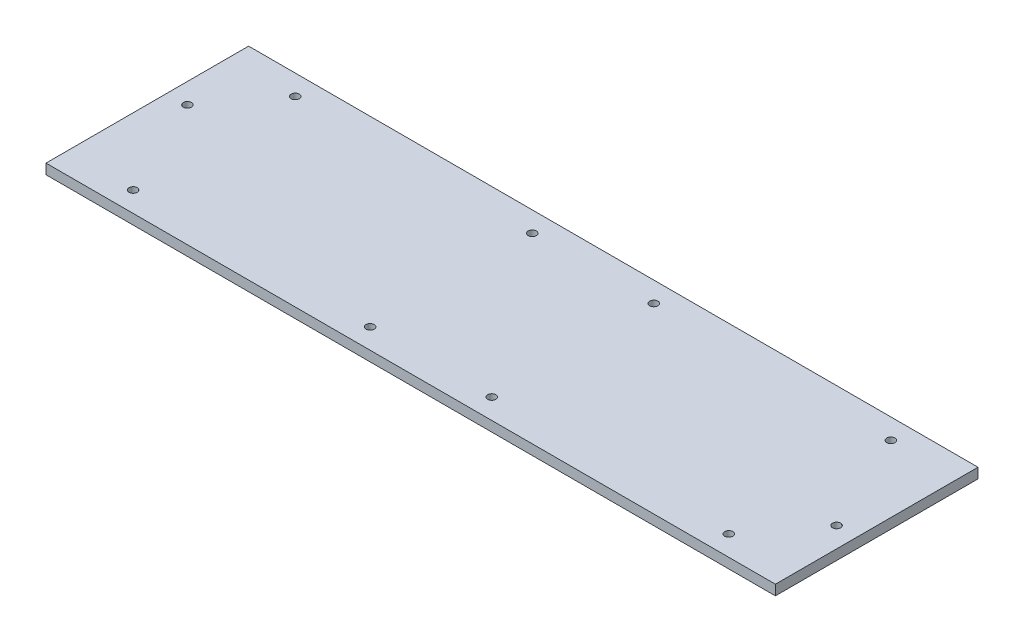
ISO-10303-21;
HEADER;
FILE_DESCRIPTION(('STEP AP214'),'2;1');
FILE_NAME('part.step','',(''),(''),'','','');
FILE_SCHEMA(('AUTOMOTIVE_DESIGN { 1 0 10303 214 1 1 1 1 }'));
ENDSEC;
DATA;
#1=APPLICATION_CONTEXT('core data for automotive mechanical design processes');
#2=APPLICATION_PROTOCOL_DEFINITION('international standard','automotive_design',2000,#1);
#3=PRODUCT_CONTEXT('',#1,'mechanical');
#4=PRODUCT('Part','Part','',(#3));
#5=PRODUCT_RELATED_PRODUCT_CATEGORY('part','',(#4));
#6=PRODUCT_DEFINITION_FORMATION('','',#4);
#7=PRODUCT_DEFINITION_CONTEXT('part definition',#1,'design');
#8=PRODUCT_DEFINITION('design','',#6,#7);
#9=PRODUCT_DEFINITION_SHAPE('','',#8);
#10=(LENGTH_UNIT() NAMED_UNIT(*) SI_UNIT(.MILLI.,.METRE.));
#11=(NAMED_UNIT(*) PLANE_ANGLE_UNIT() SI_UNIT($,.RADIAN.));
#12=(NAMED_UNIT(*) SI_UNIT($,.STERADIAN.) SOLID_ANGLE_UNIT());
#13=UNCERTAINTY_MEASURE_WITH_UNIT(LENGTH_MEASURE(1.E-05),#10,'distance_accuracy_value','');
#14=(GEOMETRIC_REPRESENTATION_CONTEXT(3) GLOBAL_UNCERTAINTY_ASSIGNED_CONTEXT((#13)) GLOBAL_UNIT_ASSIGNED_CONTEXT((#10,
#11,#12)) REPRESENTATION_CONTEXT('',''));
#15=CARTESIAN_POINT('',(0.,0.,0.));
#16=DIRECTION('',(0.,0.,1.));
#17=DIRECTION('',(1.,0.,0.));
#18=AXIS2_PLACEMENT_3D('',#15,#16,#17);
#19=CARTESIAN_POINT('',(0.,6.35,0.));
#20=DIRECTION('',(0.,-1.,0.));
#21=DIRECTION('',(0.,0.,-1.));
#22=AXIS2_PLACEMENT_3D('',#19,#20,#21);
#23=PLANE('',#22);
#24=DIRECTION('',(0.,0.,1.));
#25=VECTOR('',#24,1.);
#26=CARTESIAN_POINT('',(0.,6.35,0.));
#27=LINE('',#26,#25);
#28=CARTESIAN_POINT('',(0.,6.35,-127.));
#29=VERTEX_POINT('',#28);
#30=CARTESIAN_POINT('',(0.,6.35,0.));
#31=VERTEX_POINT('',#30);
#32=EDGE_CURVE('E87',#29,#31,#27,.T.);
#33=ORIENTED_EDGE('',*,*,#32,.T.);
#34=DIRECTION('',(1.,0.,0.));
#35=VECTOR('',#34,1.);
#36=CARTESIAN_POINT('',(0.,6.35,0.));
#37=LINE('',#36,#35);
#38=CARTESIAN_POINT('',(457.2,6.35,0.));
#39=VERTEX_POINT('',#38);
#40=EDGE_CURVE('E82',#31,#39,#37,.T.);
#41=ORIENTED_EDGE('',*,*,#40,.T.);
#42=DIRECTION('',(0.,0.,-1.));
#43=VECTOR('',#42,1.);
#44=CARTESIAN_POINT('',(457.2,6.35,0.));
#45=LINE('',#44,#43);
#46=CARTESIAN_POINT('',(457.2,6.35,-127.));
#47=VERTEX_POINT('',#46);
#48=EDGE_CURVE('E85',#39,#47,#45,.T.);
#49=ORIENTED_EDGE('',*,*,#48,.T.);
#50=DIRECTION('',(-1.,0.,0.));
#51=VECTOR('',#50,1.);
#52=CARTESIAN_POINT('',(0.,6.35,-127.));
#53=LINE('',#52,#51);
#54=EDGE_CURVE('E52',#47,#29,#53,.T.);
#55=ORIENTED_EDGE('',*,*,#54,.T.);
#56=EDGE_LOOP('',(#33,#41,#49,#55));
#57=FACE_BOUND('',#56,.T.);
#58=CARTESIAN_POINT('',(41.91,6.35,-114.3));
#59=DIRECTION('',(0.,1.,0.));
#60=DIRECTION('',(0.,0.,1.));
#61=AXIS2_PLACEMENT_3D('',#58,#59,#60);
#62=CIRCLE('',#61,2.55269999999998);
#63=CARTESIAN_POINT('',(41.91,6.35,-111.7473));
#64=VERTEX_POINT('',#63);
#65=EDGE_CURVE('E102',#64,#64,#62,.T.);
#66=ORIENTED_EDGE('',*,*,#65,.F.);
#67=EDGE_LOOP('',(#66));
#68=FACE_BOUND('',#67,.T.);
#69=CARTESIAN_POINT('',(415.29,6.35,-114.3));
#70=DIRECTION('',(0.,1.,0.));
#71=DIRECTION('',(0.,0.,1.));
#72=AXIS2_PLACEMENT_3D('',#69,#70,#71);
#73=CIRCLE('',#72,2.55270000000004);
#74=CARTESIAN_POINT('',(415.29,6.35,-111.7473));
#75=VERTEX_POINT('',#74);
#76=EDGE_CURVE('E117',#75,#75,#73,.T.);
#77=ORIENTED_EDGE('',*,*,#76,.F.);
#78=EDGE_LOOP('',(#77));
#79=FACE_BOUND('',#78,.T.);
#80=CARTESIAN_POINT('',(190.5,6.35,-114.3));
#81=DIRECTION('',(0.,1.,0.));
#82=DIRECTION('',(0.,0.,1.));
#83=AXIS2_PLACEMENT_3D('',#80,#81,#82);
#84=CIRCLE('',#83,2.55269999999998);
#85=CARTESIAN_POINT('',(190.5,6.35,-111.7473));
#86=VERTEX_POINT('',#85);
#87=EDGE_CURVE('E123',#86,#86,#84,.T.);
#88=ORIENTED_EDGE('',*,*,#87,.F.);
#89=EDGE_LOOP('',(#88));
#90=FACE_BOUND('',#89,.T.);
#91=CARTESIAN_POINT('',(266.7,6.35,-114.3));
#92=DIRECTION('',(0.,1.,0.));
#93=DIRECTION('',(0.,0.,1.));
#94=AXIS2_PLACEMENT_3D('',#91,#92,#93);
#95=CIRCLE('',#94,2.55270000000004);
#96=CARTESIAN_POINT('',(266.7,6.35,-111.7473));
#97=VERTEX_POINT('',#96);
#98=EDGE_CURVE('E129',#97,#97,#95,.T.);
#99=ORIENTED_EDGE('',*,*,#98,.F.);
#100=EDGE_LOOP('',(#99));
#101=FACE_BOUND('',#100,.T.);
#102=CARTESIAN_POINT('',(190.5,6.35,-12.7));
#103=DIRECTION('',(0.,1.,0.));
#104=DIRECTION('',(0.,0.,1.));
#105=AXIS2_PLACEMENT_3D('',#102,#103,#104);
#106=CIRCLE('',#105,2.55269999999998);
#107=CARTESIAN_POINT('',(190.5,6.35,-10.1473));
#108=VERTEX_POINT('',#107);
#109=EDGE_CURVE('E135',#108,#108,#106,.T.);
#110=ORIENTED_EDGE('',*,*,#109,.F.);
#111=EDGE_LOOP('',(#110));
#112=FACE_BOUND('',#111,.T.);
#113=CARTESIAN_POINT('',(415.29,6.35,-12.7));
#114=DIRECTION('',(0.,1.,0.));
#115=DIRECTION('',(0.,0.,1.));
#116=AXIS2_PLACEMENT_3D('',#113,#114,#115);
#117=CIRCLE('',#116,2.55270000000004);
#118=CARTESIAN_POINT('',(415.29,6.35,-10.1472999999999));
#119=VERTEX_POINT('',#118);
#120=EDGE_CURVE('E141',#119,#119,#117,.T.);
#121=ORIENTED_EDGE('',*,*,#120,.F.);
#122=EDGE_LOOP('',(#121));
#123=FACE_BOUND('',#122,.T.);
#124=CARTESIAN_POINT('',(41.91,6.35,-12.7));
#125=DIRECTION('',(0.,1.,0.));
#126=DIRECTION('',(0.,0.,1.));
#127=AXIS2_PLACEMENT_3D('',#124,#125,#126);
#128=CIRCLE('',#127,2.5527);
#129=CARTESIAN_POINT('',(41.91,6.35,-10.1473));
#130=VERTEX_POINT('',#129);
#131=EDGE_CURVE('E147',#130,#130,#128,.T.);
#132=ORIENTED_EDGE('',*,*,#131,.F.);
#133=EDGE_LOOP('',(#132));
#134=FACE_BOUND('',#133,.T.);
#135=CARTESIAN_POINT('',(266.7,6.35,-12.7));
#136=DIRECTION('',(0.,1.,0.));
#137=DIRECTION('',(0.,0.,1.));
#138=AXIS2_PLACEMENT_3D('',#135,#136,#137);
#139=CIRCLE('',#138,2.55270000000004);
#140=CARTESIAN_POINT('',(266.7,6.35,-10.1472999999999));
#141=VERTEX_POINT('',#140);
#142=EDGE_CURVE('E153',#141,#141,#139,.T.);
#143=ORIENTED_EDGE('',*,*,#142,.F.);
#144=EDGE_LOOP('',(#143));
#145=FACE_BOUND('',#144,.T.);
#146=CARTESIAN_POINT('',(444.5,6.35,-51.054));
#147=DIRECTION('',(0.,1.,0.));
#148=DIRECTION('',(0.,0.,1.));
#149=AXIS2_PLACEMENT_3D('',#146,#147,#148);
#150=CIRCLE('',#149,2.55270000000004);
#151=CARTESIAN_POINT('',(444.5,6.35,-48.5013));
#152=VERTEX_POINT('',#151);
#153=EDGE_CURVE('E159',#152,#152,#150,.T.);
#154=ORIENTED_EDGE('',*,*,#153,.F.);
#155=EDGE_LOOP('',(#154));
#156=FACE_BOUND('',#155,.T.);
#157=CARTESIAN_POINT('',(12.7,6.35,-75.946));
#158=DIRECTION('',(0.,1.,0.));
#159=DIRECTION('',(0.,0.,1.));
#160=AXIS2_PLACEMENT_3D('',#157,#158,#159);
#161=CIRCLE('',#160,2.55269999999999);
#162=CARTESIAN_POINT('',(12.7,6.35,-73.3933));
#163=VERTEX_POINT('',#162);
#164=EDGE_CURVE('E165',#163,#163,#161,.T.);
#165=ORIENTED_EDGE('',*,*,#164,.F.);
#166=EDGE_LOOP('',(#165));
#167=FACE_BOUND('',#166,.T.);
#168=ADVANCED_FACE('F35',(#57,#68,#79,#90,#101,#112,#123,#134,#145,#156,#167),#23,.F.);
#169=CARTESIAN_POINT('',(0.,0.,0.));
#170=DIRECTION('',(0.,-1.,0.));
#171=DIRECTION('',(0.,0.,-1.));
#172=AXIS2_PLACEMENT_3D('',#169,#170,#171);
#173=PLANE('',#172);
#174=CARTESIAN_POINT('',(444.5,0.,-51.054));
#175=DIRECTION('',(0.,1.,0.));
#176=DIRECTION('',(0.,0.,1.));
#177=AXIS2_PLACEMENT_3D('',#174,#175,#176);
#178=CIRCLE('',#177,2.55270000000004);
#179=CARTESIAN_POINT('',(444.5,0.,-48.5013));
#180=VERTEX_POINT('',#179);
#181=EDGE_CURVE('E162',#180,#180,#178,.T.);
#182=ORIENTED_EDGE('',*,*,#181,.T.);
#183=EDGE_LOOP('',(#182));
#184=FACE_BOUND('',#183,.T.);
#185=CARTESIAN_POINT('',(41.91,0.,-12.7));
#186=DIRECTION('',(0.,1.,0.));
#187=DIRECTION('',(0.,0.,1.));
#188=AXIS2_PLACEMENT_3D('',#185,#186,#187);
#189=CIRCLE('',#188,2.5527);
#190=CARTESIAN_POINT('',(41.91,0.,-10.1473));
#191=VERTEX_POINT('',#190);
#192=EDGE_CURVE('E150',#191,#191,#189,.T.);
#193=ORIENTED_EDGE('',*,*,#192,.T.);
#194=EDGE_LOOP('',(#193));
#195=FACE_BOUND('',#194,.T.);
#196=CARTESIAN_POINT('',(190.5,0.,-12.7));
#197=DIRECTION('',(0.,1.,0.));
#198=DIRECTION('',(0.,0.,1.));
#199=AXIS2_PLACEMENT_3D('',#196,#197,#198);
#200=CIRCLE('',#199,2.55269999999998);
#201=CARTESIAN_POINT('',(190.5,0.,-10.1473));
#202=VERTEX_POINT('',#201);
#203=EDGE_CURVE('E138',#202,#202,#200,.T.);
#204=ORIENTED_EDGE('',*,*,#203,.T.);
#205=EDGE_LOOP('',(#204));
#206=FACE_BOUND('',#205,.T.);
#207=CARTESIAN_POINT('',(190.5,0.,-114.3));
#208=DIRECTION('',(0.,1.,0.));
#209=DIRECTION('',(0.,0.,1.));
#210=AXIS2_PLACEMENT_3D('',#207,#208,#209);
#211=CIRCLE('',#210,2.55269999999998);
#212=CARTESIAN_POINT('',(190.5,0.,-111.7473));
#213=VERTEX_POINT('',#212);
#214=EDGE_CURVE('E126',#213,#213,#211,.T.);
#215=ORIENTED_EDGE('',*,*,#214,.T.);
#216=EDGE_LOOP('',(#215));
#217=FACE_BOUND('',#216,.T.);
#218=CARTESIAN_POINT('',(41.91,0.,-114.3));
#219=DIRECTION('',(0.,1.,0.));
#220=DIRECTION('',(0.,0.,1.));
#221=AXIS2_PLACEMENT_3D('',#218,#219,#220);
#222=CIRCLE('',#221,2.55269999999998);
#223=CARTESIAN_POINT('',(41.91,0.,-111.7473));
#224=VERTEX_POINT('',#223);
#225=EDGE_CURVE('E114',#224,#224,#222,.T.);
#226=ORIENTED_EDGE('',*,*,#225,.T.);
#227=EDGE_LOOP('',(#226));
#228=FACE_BOUND('',#227,.T.);
#229=DIRECTION('',(0.,0.,1.));
#230=VECTOR('',#229,1.);
#231=CARTESIAN_POINT('',(0.,0.,0.));
#232=LINE('',#231,#230);
#233=CARTESIAN_POINT('',(0.,0.,-127.));
#234=VERTEX_POINT('',#233);
#235=CARTESIAN_POINT('',(0.,0.,0.));
#236=VERTEX_POINT('',#235);
#237=EDGE_CURVE('E99',#234,#236,#232,.T.);
#238=ORIENTED_EDGE('',*,*,#237,.F.);
#239=DIRECTION('',(-1.,0.,0.));
#240=VECTOR('',#239,1.);
#241=CARTESIAN_POINT('',(0.,0.,-127.));
#242=LINE('',#241,#240);
#243=CARTESIAN_POINT('',(457.2,0.,-127.));
#244=VERTEX_POINT('',#243);
#245=EDGE_CURVE('E75',#244,#234,#242,.T.);
#246=ORIENTED_EDGE('',*,*,#245,.F.);
#247=DIRECTION('',(0.,0.,-1.));
#248=VECTOR('',#247,1.);
#249=CARTESIAN_POINT('',(457.2,0.,0.));
#250=LINE('',#249,#248);
#251=CARTESIAN_POINT('',(457.2,0.,0.));
#252=VERTEX_POINT('',#251);
#253=EDGE_CURVE('E69',#252,#244,#250,.T.);
#254=ORIENTED_EDGE('',*,*,#253,.F.);
#255=DIRECTION('',(1.,0.,0.));
#256=VECTOR('',#255,1.);
#257=CARTESIAN_POINT('',(0.,0.,0.));
#258=LINE('',#257,#256);
#259=EDGE_CURVE('E91',#236,#252,#258,.T.);
#260=ORIENTED_EDGE('',*,*,#259,.F.);
#261=EDGE_LOOP('',(#238,#246,#254,#260));
#262=FACE_BOUND('',#261,.T.);
#263=CARTESIAN_POINT('',(415.29,0.,-114.3));
#264=DIRECTION('',(0.,1.,0.));
#265=DIRECTION('',(0.,0.,1.));
#266=AXIS2_PLACEMENT_3D('',#263,#264,#265);
#267=CIRCLE('',#266,2.55270000000004);
#268=CARTESIAN_POINT('',(415.29,0.,-111.7473));
#269=VERTEX_POINT('',#268);
#270=EDGE_CURVE('E120',#269,#269,#267,.T.);
#271=ORIENTED_EDGE('',*,*,#270,.T.);
#272=EDGE_LOOP('',(#271));
#273=FACE_BOUND('',#272,.T.);
#274=CARTESIAN_POINT('',(266.7,0.,-114.3));
#275=DIRECTION('',(0.,1.,0.));
#276=DIRECTION('',(0.,0.,1.));
#277=AXIS2_PLACEMENT_3D('',#274,#275,#276);
#278=CIRCLE('',#277,2.55270000000004);
#279=CARTESIAN_POINT('',(266.7,0.,-111.7473));
#280=VERTEX_POINT('',#279);
#281=EDGE_CURVE('E132',#280,#280,#278,.T.);
#282=ORIENTED_EDGE('',*,*,#281,.T.);
#283=EDGE_LOOP('',(#282));
#284=FACE_BOUND('',#283,.T.);
#285=CARTESIAN_POINT('',(415.29,0.,-12.7));
#286=DIRECTION('',(0.,1.,0.));
#287=DIRECTION('',(0.,0.,1.));
#288=AXIS2_PLACEMENT_3D('',#285,#286,#287);
#289=CIRCLE('',#288,2.55270000000004);
#290=CARTESIAN_POINT('',(415.29,0.,-10.1472999999999));
#291=VERTEX_POINT('',#290);
#292=EDGE_CURVE('E144',#291,#291,#289,.T.);
#293=ORIENTED_EDGE('',*,*,#292,.T.);
#294=EDGE_LOOP('',(#293));
#295=FACE_BOUND('',#294,.T.);
#296=CARTESIAN_POINT('',(266.7,0.,-12.7));
#297=DIRECTION('',(0.,1.,0.));
#298=DIRECTION('',(0.,0.,1.));
#299=AXIS2_PLACEMENT_3D('',#296,#297,#298);
#300=CIRCLE('',#299,2.55270000000004);
#301=CARTESIAN_POINT('',(266.7,0.,-10.1472999999999));
#302=VERTEX_POINT('',#301);
#303=EDGE_CURVE('E156',#302,#302,#300,.T.);
#304=ORIENTED_EDGE('',*,*,#303,.T.);
#305=EDGE_LOOP('',(#304));
#306=FACE_BOUND('',#305,.T.);
#307=CARTESIAN_POINT('',(12.7,0.,-75.946));
#308=DIRECTION('',(0.,1.,0.));
#309=DIRECTION('',(0.,0.,1.));
#310=AXIS2_PLACEMENT_3D('',#307,#308,#309);
#311=CIRCLE('',#310,2.55269999999999);
#312=CARTESIAN_POINT('',(12.7,0.,-73.3933));
#313=VERTEX_POINT('',#312);
#314=EDGE_CURVE('E168',#313,#313,#311,.T.);
#315=ORIENTED_EDGE('',*,*,#314,.T.);
#316=EDGE_LOOP('',(#315));
#317=FACE_BOUND('',#316,.T.);
#318=ADVANCED_FACE('F110',(#184,#195,#206,#217,#228,#262,#273,#284,#295,#306,#317),#173,.T.);
#319=CARTESIAN_POINT('',(0.,6.35,0.));
#320=DIRECTION('',(1.,0.,0.));
#321=DIRECTION('',(0.,0.,-1.));
#322=AXIS2_PLACEMENT_3D('',#319,#320,#321);
#323=PLANE('',#322);
#324=ORIENTED_EDGE('',*,*,#237,.T.);
#325=DIRECTION('',(0.,-1.,0.));
#326=VECTOR('',#325,1.);
#327=CARTESIAN_POINT('',(0.,6.35,0.));
#328=LINE('',#327,#326);
#329=EDGE_CURVE('E11',#31,#236,#328,.T.);
#330=ORIENTED_EDGE('',*,*,#329,.F.);
#331=ORIENTED_EDGE('',*,*,#32,.F.);
#332=DIRECTION('',(0.,-1.,0.));
#333=VECTOR('',#332,1.);
#334=CARTESIAN_POINT('',(0.,6.35,-127.));
#335=LINE('',#334,#333);
#336=EDGE_CURVE('E95',#29,#234,#335,.T.);
#337=ORIENTED_EDGE('',*,*,#336,.T.);
#338=EDGE_LOOP('',(#324,#330,#331,#337));
#339=FACE_BOUND('',#338,.T.);
#340=ADVANCED_FACE('F37',(#339),#323,.F.);
#341=CARTESIAN_POINT('',(0.,6.35,0.));
#342=DIRECTION('',(0.,0.,-1.));
#343=DIRECTION('',(-1.,0.,0.));
#344=AXIS2_PLACEMENT_3D('',#341,#342,#343);
#345=PLANE('',#344);
#346=ORIENTED_EDGE('',*,*,#259,.T.);
#347=DIRECTION('',(0.,-1.,0.));
#348=VECTOR('',#347,1.);
#349=CARTESIAN_POINT('',(457.2,6.35,0.));
#350=LINE('',#349,#348);
#351=EDGE_CURVE('E44',#39,#252,#350,.T.);
#352=ORIENTED_EDGE('',*,*,#351,.F.);
#353=ORIENTED_EDGE('',*,*,#40,.F.);
#354=ORIENTED_EDGE('',*,*,#329,.T.);
#355=EDGE_LOOP('',(#346,#352,#353,#354));
#356=FACE_BOUND('',#355,.T.);
#357=ADVANCED_FACE('F90',(#356),#345,.F.);
#358=CARTESIAN_POINT('',(457.2,6.35,0.));
#359=DIRECTION('',(-1.,0.,0.));
#360=DIRECTION('',(0.,0.,1.));
#361=AXIS2_PLACEMENT_3D('',#358,#359,#360);
#362=PLANE('',#361);
#363=ORIENTED_EDGE('',*,*,#253,.T.);
#364=DIRECTION('',(0.,-1.,0.));
#365=VECTOR('',#364,1.);
#366=CARTESIAN_POINT('',(457.2,6.35,-127.));
#367=LINE('',#366,#365);
#368=EDGE_CURVE('E92',#47,#244,#367,.T.);
#369=ORIENTED_EDGE('',*,*,#368,.F.);
#370=ORIENTED_EDGE('',*,*,#48,.F.);
#371=ORIENTED_EDGE('',*,*,#351,.T.);
#372=EDGE_LOOP('',(#363,#369,#370,#371));
#373=FACE_BOUND('',#372,.T.);
#374=ADVANCED_FACE('F93',(#373),#362,.F.);
#375=CARTESIAN_POINT('',(0.,6.35,-127.));
#376=DIRECTION('',(0.,0.,1.));
#377=DIRECTION('',(1.,0.,0.));
#378=AXIS2_PLACEMENT_3D('',#375,#376,#377);
#379=PLANE('',#378);
#380=ORIENTED_EDGE('',*,*,#245,.T.);
#381=ORIENTED_EDGE('',*,*,#336,.F.);
#382=ORIENTED_EDGE('',*,*,#54,.F.);
#383=ORIENTED_EDGE('',*,*,#368,.T.);
#384=EDGE_LOOP('',(#380,#381,#382,#383));
#385=FACE_BOUND('',#384,.T.);
#386=ADVANCED_FACE('F107',(#385),#379,.F.);
#387=CARTESIAN_POINT('',(41.91,6.35,-114.3));
#388=DIRECTION('',(0.,-1.,0.));
#389=DIRECTION('',(0.,0.,-1.));
#390=AXIS2_PLACEMENT_3D('',#387,#388,#389);
#391=CYLINDRICAL_SURFACE('',#390,2.55269999999998);
#392=ORIENTED_EDGE('',*,*,#65,.T.);
#393=EDGE_LOOP('',(#392));
#394=FACE_BOUND('',#393,.T.);
#395=ORIENTED_EDGE('',*,*,#225,.F.);
#396=EDGE_LOOP('',(#395));
#397=FACE_BOUND('',#396,.T.);
#398=ADVANCED_FACE('F185',(#394,#397),#391,.F.);
#399=CARTESIAN_POINT('',(415.29,6.35,-114.3));
#400=DIRECTION('',(0.,-1.,0.));
#401=DIRECTION('',(0.,0.,-1.));
#402=AXIS2_PLACEMENT_3D('',#399,#400,#401);
#403=CYLINDRICAL_SURFACE('',#402,2.55270000000004);
#404=ORIENTED_EDGE('',*,*,#76,.T.);
#405=EDGE_LOOP('',(#404));
#406=FACE_BOUND('',#405,.T.);
#407=ORIENTED_EDGE('',*,*,#270,.F.);
#408=EDGE_LOOP('',(#407));
#409=FACE_BOUND('',#408,.T.);
#410=ADVANCED_FACE('F231',(#406,#409),#403,.F.);
#411=CARTESIAN_POINT('',(190.5,6.35,-114.3));
#412=DIRECTION('',(0.,-1.,0.));
#413=DIRECTION('',(0.,0.,-1.));
#414=AXIS2_PLACEMENT_3D('',#411,#412,#413);
#415=CYLINDRICAL_SURFACE('',#414,2.55269999999998);
#416=ORIENTED_EDGE('',*,*,#87,.T.);
#417=EDGE_LOOP('',(#416));
#418=FACE_BOUND('',#417,.T.);
#419=ORIENTED_EDGE('',*,*,#214,.F.);
#420=EDGE_LOOP('',(#419));
#421=FACE_BOUND('',#420,.T.);
#422=ADVANCED_FACE('F239',(#418,#421),#415,.F.);
#423=CARTESIAN_POINT('',(266.7,6.35,-114.3));
#424=DIRECTION('',(0.,-1.,0.));
#425=DIRECTION('',(0.,0.,-1.));
#426=AXIS2_PLACEMENT_3D('',#423,#424,#425);
#427=CYLINDRICAL_SURFACE('',#426,2.55270000000004);
#428=ORIENTED_EDGE('',*,*,#98,.T.);
#429=EDGE_LOOP('',(#428));
#430=FACE_BOUND('',#429,.T.);
#431=ORIENTED_EDGE('',*,*,#281,.F.);
#432=EDGE_LOOP('',(#431));
#433=FACE_BOUND('',#432,.T.);
#434=ADVANCED_FACE('F247',(#430,#433),#427,.F.);
#435=CARTESIAN_POINT('',(190.5,6.35,-12.7));
#436=DIRECTION('',(0.,-1.,0.));
#437=DIRECTION('',(0.,0.,-1.));
#438=AXIS2_PLACEMENT_3D('',#435,#436,#437);
#439=CYLINDRICAL_SURFACE('',#438,2.55269999999998);
#440=ORIENTED_EDGE('',*,*,#109,.T.);
#441=EDGE_LOOP('',(#440));
#442=FACE_BOUND('',#441,.T.);
#443=ORIENTED_EDGE('',*,*,#203,.F.);
#444=EDGE_LOOP('',(#443));
#445=FACE_BOUND('',#444,.T.);
#446=ADVANCED_FACE('F256',(#442,#445),#439,.F.);
#447=CARTESIAN_POINT('',(415.29,6.35,-12.7));
#448=DIRECTION('',(0.,-1.,0.));
#449=DIRECTION('',(0.,0.,-1.));
#450=AXIS2_PLACEMENT_3D('',#447,#448,#449);
#451=CYLINDRICAL_SURFACE('',#450,2.55270000000004);
#452=ORIENTED_EDGE('',*,*,#120,.T.);
#453=EDGE_LOOP('',(#452));
#454=FACE_BOUND('',#453,.T.);
#455=ORIENTED_EDGE('',*,*,#292,.F.);
#456=EDGE_LOOP('',(#455));
#457=FACE_BOUND('',#456,.T.);
#458=ADVANCED_FACE('F265',(#454,#457),#451,.F.);
#459=CARTESIAN_POINT('',(41.91,6.35,-12.7));
#460=DIRECTION('',(0.,-1.,0.));
#461=DIRECTION('',(0.,0.,-1.));
#462=AXIS2_PLACEMENT_3D('',#459,#460,#461);
#463=CYLINDRICAL_SURFACE('',#462,2.5527);
#464=ORIENTED_EDGE('',*,*,#131,.T.);
#465=EDGE_LOOP('',(#464));
#466=FACE_BOUND('',#465,.T.);
#467=ORIENTED_EDGE('',*,*,#192,.F.);
#468=EDGE_LOOP('',(#467));
#469=FACE_BOUND('',#468,.T.);
#470=ADVANCED_FACE('F274',(#466,#469),#463,.F.);
#471=CARTESIAN_POINT('',(266.7,6.35,-12.7));
#472=DIRECTION('',(0.,-1.,0.));
#473=DIRECTION('',(0.,0.,-1.));
#474=AXIS2_PLACEMENT_3D('',#471,#472,#473);
#475=CYLINDRICAL_SURFACE('',#474,2.55270000000004);
#476=ORIENTED_EDGE('',*,*,#142,.T.);
#477=EDGE_LOOP('',(#476));
#478=FACE_BOUND('',#477,.T.);
#479=ORIENTED_EDGE('',*,*,#303,.F.);
#480=EDGE_LOOP('',(#479));
#481=FACE_BOUND('',#480,.T.);
#482=ADVANCED_FACE('F283',(#478,#481),#475,.F.);
#483=CARTESIAN_POINT('',(444.5,6.35,-51.054));
#484=DIRECTION('',(0.,-1.,0.));
#485=DIRECTION('',(0.,0.,-1.));
#486=AXIS2_PLACEMENT_3D('',#483,#484,#485);
#487=CYLINDRICAL_SURFACE('',#486,2.55270000000004);
#488=ORIENTED_EDGE('',*,*,#153,.T.);
#489=EDGE_LOOP('',(#488));
#490=FACE_BOUND('',#489,.T.);
#491=ORIENTED_EDGE('',*,*,#181,.F.);
#492=EDGE_LOOP('',(#491));
#493=FACE_BOUND('',#492,.T.);
#494=ADVANCED_FACE('F292',(#490,#493),#487,.F.);
#495=CARTESIAN_POINT('',(12.7,6.35,-75.946));
#496=DIRECTION('',(0.,-1.,0.));
#497=DIRECTION('',(0.,0.,-1.));
#498=AXIS2_PLACEMENT_3D('',#495,#496,#497);
#499=CYLINDRICAL_SURFACE('',#498,2.55269999999999);
#500=ORIENTED_EDGE('',*,*,#164,.T.);
#501=EDGE_LOOP('',(#500));
#502=FACE_BOUND('',#501,.T.);
#503=ORIENTED_EDGE('',*,*,#314,.F.);
#504=EDGE_LOOP('',(#503));
#505=FACE_BOUND('',#504,.T.);
#506=ADVANCED_FACE('F174',(#502,#505),#499,.F.);
#507=CLOSED_SHELL('',(#168,#318,#340,#357,#374,#386,#398,#410,#422,#434,#446,#458,#470,#482,
#494,#506));
#508=MANIFOLD_SOLID_BREP('B2',#507);
#509=ADVANCED_BREP_SHAPE_REPRESENTATION('',(#18,#508),#14);
#510=SHAPE_DEFINITION_REPRESENTATION(#9,#509);
ENDSEC;
END-ISO-10303-21;
